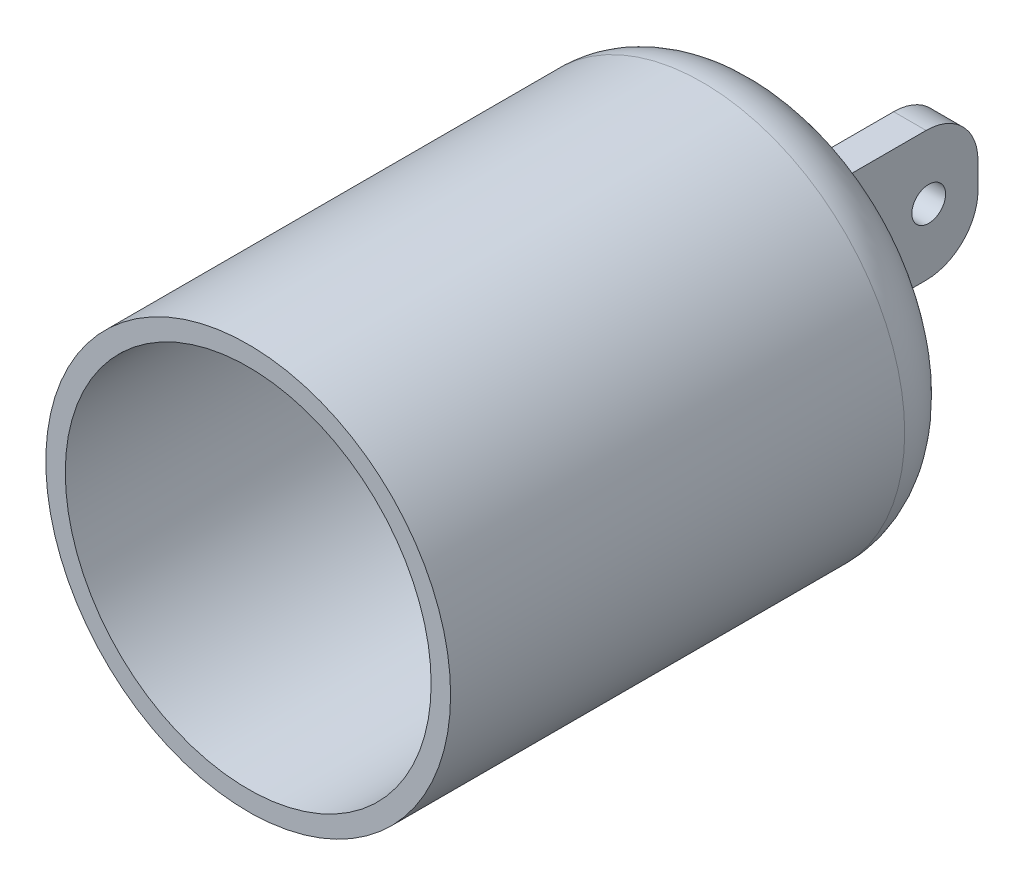
ISO-10303-21;
HEADER;
FILE_DESCRIPTION(('STEP AP214'),'2;1');
FILE_NAME('part.step','',(''),(''),'','','');
FILE_SCHEMA(('AUTOMOTIVE_DESIGN { 1 0 10303 214 1 1 1 1 }'));
ENDSEC;
DATA;
#1=APPLICATION_CONTEXT('core data for automotive mechanical design processes');
#2=APPLICATION_PROTOCOL_DEFINITION('international standard','automotive_design',2000,#1);
#3=PRODUCT_CONTEXT('',#1,'mechanical');
#4=PRODUCT('Part','Part','',(#3));
#5=PRODUCT_RELATED_PRODUCT_CATEGORY('part','',(#4));
#6=PRODUCT_DEFINITION_FORMATION('','',#4);
#7=PRODUCT_DEFINITION_CONTEXT('part definition',#1,'design');
#8=PRODUCT_DEFINITION('design','',#6,#7);
#9=PRODUCT_DEFINITION_SHAPE('','',#8);
#10=(LENGTH_UNIT() NAMED_UNIT(*) SI_UNIT(.MILLI.,.METRE.));
#11=(NAMED_UNIT(*) PLANE_ANGLE_UNIT() SI_UNIT($,.RADIAN.));
#12=(NAMED_UNIT(*) SI_UNIT($,.STERADIAN.) SOLID_ANGLE_UNIT());
#13=UNCERTAINTY_MEASURE_WITH_UNIT(LENGTH_MEASURE(1.E-05),#10,'distance_accuracy_value','');
#14=(GEOMETRIC_REPRESENTATION_CONTEXT(3) GLOBAL_UNCERTAINTY_ASSIGNED_CONTEXT((#13)) GLOBAL_UNIT_ASSIGNED_CONTEXT((#10,
#11,#12)) REPRESENTATION_CONTEXT('',''));
#15=CARTESIAN_POINT('',(0.,0.,0.));
#16=DIRECTION('',(0.,0.,1.));
#17=DIRECTION('',(1.,0.,0.));
#18=AXIS2_PLACEMENT_3D('',#15,#16,#17);
#19=CARTESIAN_POINT('',(0.,0.,0.));
#20=DIRECTION('',(0.,0.,1.));
#21=DIRECTION('',(1.,0.,0.));
#22=AXIS2_PLACEMENT_3D('',#19,#20,#21);
#23=PLANE('',#22);
#24=CARTESIAN_POINT('',(0.,0.,0.));
#25=DIRECTION('',(0.,0.,1.));
#26=DIRECTION('',(1.,0.,0.));
#27=AXIS2_PLACEMENT_3D('',#24,#25,#26);
#28=CIRCLE('',#27,106.);
#29=CARTESIAN_POINT('',(106.,0.,0.));
#30=VERTEX_POINT('',#29);
#31=EDGE_CURVE('E11',#30,#30,#28,.F.);
#32=ORIENTED_EDGE('',*,*,#31,.T.);
#33=EDGE_LOOP('',(#32));
#34=FACE_BOUND('',#33,.T.);
#35=DIRECTION('',(1.,0.,0.));
#36=VECTOR('',#35,1.);
#37=CARTESIAN_POINT('',(-12.5,70.,0.));
#38=LINE('',#37,#36);
#39=CARTESIAN_POINT('',(32.5,70.,0.));
#40=VERTEX_POINT('',#39);
#41=CARTESIAN_POINT('',(-32.5,70.,0.));
#42=VERTEX_POINT('',#41);
#43=EDGE_CURVE('E213',#40,#42,#38,.F.);
#44=ORIENTED_EDGE('',*,*,#43,.T.);
#45=DIRECTION('',(0.,1.,0.));
#46=VECTOR('',#45,1.);
#47=CARTESIAN_POINT('',(-32.5,-50.,0.));
#48=LINE('',#47,#46);
#49=CARTESIAN_POINT('',(-32.5,-70.,0.));
#50=VERTEX_POINT('',#49);
#51=EDGE_CURVE('E219',#42,#50,#48,.F.);
#52=ORIENTED_EDGE('',*,*,#51,.T.);
#53=DIRECTION('',(-1.,0.,0.));
#54=VECTOR('',#53,1.);
#55=CARTESIAN_POINT('',(12.5,-70.,0.));
#56=LINE('',#55,#54);
#57=CARTESIAN_POINT('',(32.5,-70.,0.));
#58=VERTEX_POINT('',#57);
#59=EDGE_CURVE('E217',#50,#58,#56,.F.);
#60=ORIENTED_EDGE('',*,*,#59,.T.);
#61=DIRECTION('',(0.,-1.,0.));
#62=VECTOR('',#61,1.);
#63=CARTESIAN_POINT('',(32.5,50.,0.));
#64=LINE('',#63,#62);
#65=EDGE_CURVE('E215',#58,#40,#64,.F.);
#66=ORIENTED_EDGE('',*,*,#65,.T.);
#67=EDGE_LOOP('',(#44,#52,#60,#66));
#68=FACE_BOUND('',#67,.T.);
#69=ADVANCED_FACE('F39',(#34,#68),#23,.F.);
#70=CARTESIAN_POINT('',(0.,0.,400.));
#71=DIRECTION('',(0.,0.,-1.));
#72=DIRECTION('',(-1.,0.,0.));
#73=AXIS2_PLACEMENT_3D('',#70,#71,#72);
#74=CYLINDRICAL_SURFACE('',#73,156.);
#75=CARTESIAN_POINT('',(0.,0.,50.));
#76=DIRECTION('',(0.,0.,1.));
#77=DIRECTION('',(1.,0.,0.));
#78=AXIS2_PLACEMENT_3D('',#75,#76,#77);
#79=CIRCLE('',#78,156.);
#80=CARTESIAN_POINT('',(156.,0.,50.));
#81=VERTEX_POINT('',#80);
#82=EDGE_CURVE('E47',#81,#81,#79,.T.);
#83=ORIENTED_EDGE('',*,*,#82,.T.);
#84=EDGE_LOOP('',(#83));
#85=FACE_BOUND('',#84,.T.);
#86=CARTESIAN_POINT('',(0.,0.,400.));
#87=DIRECTION('',(0.,0.,1.));
#88=DIRECTION('',(1.,0.,0.));
#89=AXIS2_PLACEMENT_3D('',#86,#87,#88);
#90=CIRCLE('',#89,156.);
#91=CARTESIAN_POINT('',(156.,0.,400.));
#92=VERTEX_POINT('',#91);
#93=EDGE_CURVE('E187',#92,#92,#90,.T.);
#94=ORIENTED_EDGE('',*,*,#93,.F.);
#95=EDGE_LOOP('',(#94));
#96=FACE_BOUND('',#95,.T.);
#97=ADVANCED_FACE('F236',(#85,#96),#74,.T.);
#98=CARTESIAN_POINT('',(0.,0.,400.));
#99=DIRECTION('',(0.,0.,1.));
#100=DIRECTION('',(1.,0.,0.));
#101=AXIS2_PLACEMENT_3D('',#98,#99,#100);
#102=PLANE('',#101);
#103=CARTESIAN_POINT('',(0.,0.,400.));
#104=DIRECTION('',(0.,0.,1.));
#105=DIRECTION('',(1.,0.,0.));
#106=AXIS2_PLACEMENT_3D('',#103,#104,#105);
#107=CIRCLE('',#106,141.);
#108=CARTESIAN_POINT('',(141.,0.,400.));
#109=VERTEX_POINT('',#108);
#110=EDGE_CURVE('E144',#109,#109,#107,.T.);
#111=ORIENTED_EDGE('',*,*,#110,.F.);
#112=EDGE_LOOP('',(#111));
#113=FACE_BOUND('',#112,.T.);
#114=ORIENTED_EDGE('',*,*,#93,.T.);
#115=EDGE_LOOP('',(#114));
#116=FACE_BOUND('',#115,.T.);
#117=ADVANCED_FACE('F259',(#113,#116),#102,.T.);
#118=CARTESIAN_POINT('',(12.5,-50.,-150.));
#119=DIRECTION('',(-1.,0.,0.));
#120=DIRECTION('',(0.,0.,1.));
#121=AXIS2_PLACEMENT_3D('',#118,#119,#120);
#122=PLANE('',#121);
#123=CARTESIAN_POINT('',(12.5,0.,-112.));
#124=DIRECTION('',(1.,0.,0.));
#125=DIRECTION('',(0.,0.,-1.));
#126=AXIS2_PLACEMENT_3D('',#123,#124,#125);
#127=CIRCLE('',#126,13.);
#128=CARTESIAN_POINT('',(12.5,0.,-125.));
#129=VERTEX_POINT('',#128);
#130=EDGE_CURVE('E167',#129,#129,#127,.T.);
#131=ORIENTED_EDGE('',*,*,#130,.F.);
#132=EDGE_LOOP('',(#131));
#133=FACE_BOUND('',#132,.T.);
#134=DIRECTION('',(0.,0.,1.));
#135=VECTOR('',#134,1.);
#136=CARTESIAN_POINT('',(12.5,50.,-150.));
#137=LINE('',#136,#135);
#138=CARTESIAN_POINT('',(12.5,50.,-110.));
#139=VERTEX_POINT('',#138);
#140=CARTESIAN_POINT('',(12.5,50.,-20.));
#141=VERTEX_POINT('',#140);
#142=EDGE_CURVE('E178',#139,#141,#137,.T.);
#143=ORIENTED_EDGE('',*,*,#142,.T.);
#144=DIRECTION('',(0.,-1.,0.));
#145=VECTOR('',#144,1.);
#146=CARTESIAN_POINT('',(12.5,-50.,-20.));
#147=LINE('',#146,#145);
#148=CARTESIAN_POINT('',(12.5,-50.,-20.));
#149=VERTEX_POINT('',#148);
#150=EDGE_CURVE('E61',#141,#149,#147,.T.);
#151=ORIENTED_EDGE('',*,*,#150,.T.);
#152=DIRECTION('',(0.,0.,1.));
#153=VECTOR('',#152,1.);
#154=CARTESIAN_POINT('',(12.5,-50.,-150.));
#155=LINE('',#154,#153);
#156=CARTESIAN_POINT('',(12.5,-50.,-110.));
#157=VERTEX_POINT('',#156);
#158=EDGE_CURVE('E185',#157,#149,#155,.T.);
#159=ORIENTED_EDGE('',*,*,#158,.F.);
#160=CARTESIAN_POINT('',(12.5,-10.,-110.));
#161=DIRECTION('',(-1.,0.,0.));
#162=DIRECTION('',(0.,0.,1.));
#163=AXIS2_PLACEMENT_3D('',#160,#161,#162);
#164=CIRCLE('',#163,40.);
#165=CARTESIAN_POINT('',(12.5,-10.,-150.));
#166=VERTEX_POINT('',#165);
#167=EDGE_CURVE('E198',#157,#166,#164,.F.);
#168=ORIENTED_EDGE('',*,*,#167,.T.);
#169=DIRECTION('',(0.,-1.,0.));
#170=VECTOR('',#169,1.);
#171=CARTESIAN_POINT('',(12.5,-50.,-150.));
#172=LINE('',#171,#170);
#173=CARTESIAN_POINT('',(12.5,10.,-150.));
#174=VERTEX_POINT('',#173);
#175=EDGE_CURVE('E172',#174,#166,#172,.T.);
#176=ORIENTED_EDGE('',*,*,#175,.F.);
#177=CARTESIAN_POINT('',(12.5,10.,-110.));
#178=DIRECTION('',(-1.,0.,0.));
#179=DIRECTION('',(0.,0.,1.));
#180=AXIS2_PLACEMENT_3D('',#177,#178,#179);
#181=CIRCLE('',#180,40.);
#182=EDGE_CURVE('E200',#174,#139,#181,.F.);
#183=ORIENTED_EDGE('',*,*,#182,.T.);
#184=EDGE_LOOP('',(#143,#151,#159,#168,#176,#183));
#185=FACE_BOUND('',#184,.T.);
#186=ADVANCED_FACE('F309',(#133,#185),#122,.F.);
#187=CARTESIAN_POINT('',(-12.5,-50.,-150.));
#188=DIRECTION('',(0.,1.,0.));
#189=DIRECTION('',(0.,0.,1.));
#190=AXIS2_PLACEMENT_3D('',#187,#188,#189);
#191=PLANE('',#190);
#192=ORIENTED_EDGE('',*,*,#158,.T.);
#193=DIRECTION('',(-1.,0.,0.));
#194=VECTOR('',#193,1.);
#195=CARTESIAN_POINT('',(-12.5,-50.,-20.));
#196=LINE('',#195,#194);
#197=CARTESIAN_POINT('',(-12.5,-50.,-20.));
#198=VERTEX_POINT('',#197);
#199=EDGE_CURVE('E222',#149,#198,#196,.T.);
#200=ORIENTED_EDGE('',*,*,#199,.T.);
#201=DIRECTION('',(0.,0.,1.));
#202=VECTOR('',#201,1.);
#203=CARTESIAN_POINT('',(-12.5,-50.,-150.));
#204=LINE('',#203,#202);
#205=CARTESIAN_POINT('',(-12.5,-50.,-110.));
#206=VERTEX_POINT('',#205);
#207=EDGE_CURVE('E182',#206,#198,#204,.T.);
#208=ORIENTED_EDGE('',*,*,#207,.F.);
#209=DIRECTION('',(-1.,0.,0.));
#210=VECTOR('',#209,1.);
#211=CARTESIAN_POINT('',(12.5,-50.,-110.));
#212=LINE('',#211,#210);
#213=EDGE_CURVE('E208',#206,#157,#212,.F.);
#214=ORIENTED_EDGE('',*,*,#213,.T.);
#215=EDGE_LOOP('',(#192,#200,#208,#214));
#216=FACE_BOUND('',#215,.T.);
#217=ADVANCED_FACE('F297',(#216),#191,.F.);
#218=CARTESIAN_POINT('',(-12.5,-50.,-150.));
#219=DIRECTION('',(1.,0.,0.));
#220=DIRECTION('',(0.,0.,-1.));
#221=AXIS2_PLACEMENT_3D('',#218,#219,#220);
#222=PLANE('',#221);
#223=CARTESIAN_POINT('',(-12.5,0.,-112.));
#224=DIRECTION('',(1.,0.,0.));
#225=DIRECTION('',(0.,0.,-1.));
#226=AXIS2_PLACEMENT_3D('',#223,#224,#225);
#227=CIRCLE('',#226,13.);
#228=CARTESIAN_POINT('',(-12.5,0.,-125.));
#229=VERTEX_POINT('',#228);
#230=EDGE_CURVE('E170',#229,#229,#227,.T.);
#231=ORIENTED_EDGE('',*,*,#230,.T.);
#232=EDGE_LOOP('',(#231));
#233=FACE_BOUND('',#232,.T.);
#234=ORIENTED_EDGE('',*,*,#207,.T.);
#235=DIRECTION('',(0.,1.,0.));
#236=VECTOR('',#235,1.);
#237=CARTESIAN_POINT('',(-12.5,50.,-20.));
#238=LINE('',#237,#236);
#239=CARTESIAN_POINT('',(-12.5,50.,-20.));
#240=VERTEX_POINT('',#239);
#241=EDGE_CURVE('E210',#198,#240,#238,.T.);
#242=ORIENTED_EDGE('',*,*,#241,.T.);
#243=DIRECTION('',(0.,0.,1.));
#244=VECTOR('',#243,1.);
#245=CARTESIAN_POINT('',(-12.5,50.,-150.));
#246=LINE('',#245,#244);
#247=CARTESIAN_POINT('',(-12.5,50.,-110.));
#248=VERTEX_POINT('',#247);
#249=EDGE_CURVE('E180',#248,#240,#246,.T.);
#250=ORIENTED_EDGE('',*,*,#249,.F.);
#251=CARTESIAN_POINT('',(-12.5,10.,-110.));
#252=DIRECTION('',(1.,0.,0.));
#253=DIRECTION('',(0.,0.,-1.));
#254=AXIS2_PLACEMENT_3D('',#251,#252,#253);
#255=CIRCLE('',#254,40.);
#256=CARTESIAN_POINT('',(-12.5,10.,-150.));
#257=VERTEX_POINT('',#256);
#258=EDGE_CURVE('E206',#248,#257,#255,.F.);
#259=ORIENTED_EDGE('',*,*,#258,.T.);
#260=DIRECTION('',(0.,1.,0.));
#261=VECTOR('',#260,1.);
#262=CARTESIAN_POINT('',(-12.5,-50.,-150.));
#263=LINE('',#262,#261);
#264=CARTESIAN_POINT('',(-12.5,-10.,-150.));
#265=VERTEX_POINT('',#264);
#266=EDGE_CURVE('E175',#265,#257,#263,.T.);
#267=ORIENTED_EDGE('',*,*,#266,.F.);
#268=CARTESIAN_POINT('',(-12.5,-10.,-110.));
#269=DIRECTION('',(1.,0.,0.));
#270=DIRECTION('',(0.,0.,-1.));
#271=AXIS2_PLACEMENT_3D('',#268,#269,#270);
#272=CIRCLE('',#271,40.);
#273=EDGE_CURVE('E204',#265,#206,#272,.F.);
#274=ORIENTED_EDGE('',*,*,#273,.T.);
#275=EDGE_LOOP('',(#234,#242,#250,#259,#267,#274));
#276=FACE_BOUND('',#275,.T.);
#277=ADVANCED_FACE('F300',(#233,#276),#222,.F.);
#278=CARTESIAN_POINT('',(-12.5,50.,-150.));
#279=DIRECTION('',(0.,-1.,0.));
#280=DIRECTION('',(0.,0.,-1.));
#281=AXIS2_PLACEMENT_3D('',#278,#279,#280);
#282=PLANE('',#281);
#283=ORIENTED_EDGE('',*,*,#249,.T.);
#284=DIRECTION('',(1.,0.,0.));
#285=VECTOR('',#284,1.);
#286=CARTESIAN_POINT('',(12.5,50.,-20.));
#287=LINE('',#286,#285);
#288=EDGE_CURVE('E54',#240,#141,#287,.T.);
#289=ORIENTED_EDGE('',*,*,#288,.T.);
#290=ORIENTED_EDGE('',*,*,#142,.F.);
#291=DIRECTION('',(1.,0.,0.));
#292=VECTOR('',#291,1.);
#293=CARTESIAN_POINT('',(-12.5,50.,-110.));
#294=LINE('',#293,#292);
#295=EDGE_CURVE('E202',#139,#248,#294,.F.);
#296=ORIENTED_EDGE('',*,*,#295,.T.);
#297=EDGE_LOOP('',(#283,#289,#290,#296));
#298=FACE_BOUND('',#297,.T.);
#299=ADVANCED_FACE('F311',(#298),#282,.F.);
#300=CARTESIAN_POINT('',(0.,0.,-150.));
#301=DIRECTION('',(0.,0.,-1.));
#302=DIRECTION('',(-1.,0.,0.));
#303=AXIS2_PLACEMENT_3D('',#300,#301,#302);
#304=PLANE('',#303);
#305=ORIENTED_EDGE('',*,*,#266,.T.);
#306=DIRECTION('',(1.,0.,0.));
#307=VECTOR('',#306,1.);
#308=CARTESIAN_POINT('',(12.5,10.,-150.));
#309=LINE('',#308,#307);
#310=EDGE_CURVE('E195',#257,#174,#309,.T.);
#311=ORIENTED_EDGE('',*,*,#310,.T.);
#312=ORIENTED_EDGE('',*,*,#175,.T.);
#313=DIRECTION('',(-1.,0.,0.));
#314=VECTOR('',#313,1.);
#315=CARTESIAN_POINT('',(-12.5,-10.,-150.));
#316=LINE('',#315,#314);
#317=EDGE_CURVE('E190',#166,#265,#316,.T.);
#318=ORIENTED_EDGE('',*,*,#317,.T.);
#319=EDGE_LOOP('',(#305,#311,#312,#318));
#320=FACE_BOUND('',#319,.T.);
#321=ADVANCED_FACE('F306',(#320),#304,.T.);
#322=CARTESIAN_POINT('',(-156.,0.,-112.));
#323=DIRECTION('',(1.,0.,0.));
#324=DIRECTION('',(0.,0.,-1.));
#325=AXIS2_PLACEMENT_3D('',#322,#323,#324);
#326=CYLINDRICAL_SURFACE('',#325,13.);
#327=ORIENTED_EDGE('',*,*,#130,.T.);
#328=EDGE_LOOP('',(#327));
#329=FACE_BOUND('',#328,.T.);
#330=ORIENTED_EDGE('',*,*,#230,.F.);
#331=EDGE_LOOP('',(#330));
#332=FACE_BOUND('',#331,.T.);
#333=ADVANCED_FACE('F269',(#329,#332),#326,.F.);
#334=CARTESIAN_POINT('',(0.,10.,-110.));
#335=DIRECTION('',(-1.,0.,0.));
#336=DIRECTION('',(0.,0.,1.));
#337=AXIS2_PLACEMENT_3D('',#334,#335,#336);
#338=CYLINDRICAL_SURFACE('',#337,40.);
#339=ORIENTED_EDGE('',*,*,#258,.F.);
#340=ORIENTED_EDGE('',*,*,#295,.F.);
#341=ORIENTED_EDGE('',*,*,#182,.F.);
#342=ORIENTED_EDGE('',*,*,#310,.F.);
#343=EDGE_LOOP('',(#339,#340,#341,#342));
#344=FACE_BOUND('',#343,.T.);
#345=ADVANCED_FACE('F265',(#344),#338,.T.);
#346=CARTESIAN_POINT('',(0.,-10.,-110.));
#347=DIRECTION('',(1.,0.,0.));
#348=DIRECTION('',(0.,0.,-1.));
#349=AXIS2_PLACEMENT_3D('',#346,#347,#348);
#350=CYLINDRICAL_SURFACE('',#349,40.);
#351=ORIENTED_EDGE('',*,*,#167,.F.);
#352=ORIENTED_EDGE('',*,*,#213,.F.);
#353=ORIENTED_EDGE('',*,*,#273,.F.);
#354=ORIENTED_EDGE('',*,*,#317,.F.);
#355=EDGE_LOOP('',(#351,#352,#353,#354));
#356=FACE_BOUND('',#355,.T.);
#357=ADVANCED_FACE('F268',(#356),#350,.T.);
#358=CARTESIAN_POINT('',(32.5,-50.,-20.));
#359=DIRECTION('',(0.,1.,0.));
#360=DIRECTION('',(0.,0.,1.));
#361=AXIS2_PLACEMENT_3D('',#358,#359,#360);
#362=CYLINDRICAL_SURFACE('',#361,20.);
#363=CARTESIAN_POINT('',(32.5,70.,-20.));
#364=DIRECTION('',(-0.707106781186547,0.707106781186547,0.));
#365=DIRECTION('',(-0.707106781186547,-0.707106781186547,0.));
#366=AXIS2_PLACEMENT_3D('',#363,#364,#365);
#367=ELLIPSE('',#366,28.2842712474619,20.);
#368=EDGE_CURVE('E229',#40,#141,#367,.F.);
#369=ORIENTED_EDGE('',*,*,#368,.F.);
#370=ORIENTED_EDGE('',*,*,#65,.F.);
#371=CARTESIAN_POINT('',(32.5,-70.,-20.));
#372=DIRECTION('',(0.707106781186547,0.707106781186547,0.));
#373=DIRECTION('',(-0.707106781186547,0.707106781186547,0.));
#374=AXIS2_PLACEMENT_3D('',#371,#372,#373);
#375=ELLIPSE('',#374,28.2842712474619,20.);
#376=EDGE_CURVE('E171',#149,#58,#375,.T.);
#377=ORIENTED_EDGE('',*,*,#376,.F.);
#378=ORIENTED_EDGE('',*,*,#150,.F.);
#379=EDGE_LOOP('',(#369,#370,#377,#378));
#380=FACE_BOUND('',#379,.T.);
#381=ADVANCED_FACE('F272',(#380),#362,.F.);
#382=CARTESIAN_POINT('',(-12.5,-70.,-20.));
#383=DIRECTION('',(1.,0.,0.));
#384=DIRECTION('',(0.,0.,-1.));
#385=AXIS2_PLACEMENT_3D('',#382,#383,#384);
#386=CYLINDRICAL_SURFACE('',#385,20.);
#387=ORIENTED_EDGE('',*,*,#376,.T.);
#388=ORIENTED_EDGE('',*,*,#59,.F.);
#389=CARTESIAN_POINT('',(-32.5,-70.,-20.));
#390=DIRECTION('',(0.707106781186547,-0.707106781186547,0.));
#391=DIRECTION('',(0.707106781186547,0.707106781186547,0.));
#392=AXIS2_PLACEMENT_3D('',#389,#390,#391);
#393=ELLIPSE('',#392,28.2842712474619,20.);
#394=EDGE_CURVE('E227',#198,#50,#393,.T.);
#395=ORIENTED_EDGE('',*,*,#394,.F.);
#396=ORIENTED_EDGE('',*,*,#199,.F.);
#397=EDGE_LOOP('',(#387,#388,#395,#396));
#398=FACE_BOUND('',#397,.T.);
#399=ADVANCED_FACE('F277',(#398),#386,.F.);
#400=CARTESIAN_POINT('',(-12.5,70.,-20.));
#401=DIRECTION('',(-1.,0.,0.));
#402=DIRECTION('',(0.,0.,1.));
#403=AXIS2_PLACEMENT_3D('',#400,#401,#402);
#404=CYLINDRICAL_SURFACE('',#403,20.);
#405=ORIENTED_EDGE('',*,*,#368,.T.);
#406=ORIENTED_EDGE('',*,*,#288,.F.);
#407=CARTESIAN_POINT('',(-32.5,70.,-20.));
#408=DIRECTION('',(-0.707106781186547,-0.707106781186547,0.));
#409=DIRECTION('',(-0.707106781186547,0.707106781186547,0.));
#410=AXIS2_PLACEMENT_3D('',#407,#408,#409);
#411=ELLIPSE('',#410,28.2842712474619,20.);
#412=EDGE_CURVE('E166',#42,#240,#411,.F.);
#413=ORIENTED_EDGE('',*,*,#412,.F.);
#414=ORIENTED_EDGE('',*,*,#43,.F.);
#415=EDGE_LOOP('',(#405,#406,#413,#414));
#416=FACE_BOUND('',#415,.T.);
#417=ADVANCED_FACE('F249',(#416),#404,.F.);
#418=CARTESIAN_POINT('',(-32.5,-50.,-20.));
#419=DIRECTION('',(0.,-1.,0.));
#420=DIRECTION('',(0.,0.,-1.));
#421=AXIS2_PLACEMENT_3D('',#418,#419,#420);
#422=CYLINDRICAL_SURFACE('',#421,20.);
#423=ORIENTED_EDGE('',*,*,#394,.T.);
#424=ORIENTED_EDGE('',*,*,#51,.F.);
#425=ORIENTED_EDGE('',*,*,#412,.T.);
#426=ORIENTED_EDGE('',*,*,#241,.F.);
#427=EDGE_LOOP('',(#423,#424,#425,#426));
#428=FACE_BOUND('',#427,.T.);
#429=ADVANCED_FACE('F240',(#428),#422,.F.);
#430=CARTESIAN_POINT('',(0.,0.,50.));
#431=DIRECTION('',(0.,0.,1.));
#432=DIRECTION('',(1.,0.,0.));
#433=AXIS2_PLACEMENT_3D('',#430,#431,#432);
#434=TOROIDAL_SURFACE('',#433,106.,50.);
#435=ORIENTED_EDGE('',*,*,#31,.F.);
#436=EDGE_LOOP('',(#435));
#437=FACE_BOUND('',#436,.T.);
#438=ORIENTED_EDGE('',*,*,#82,.F.);
#439=EDGE_LOOP('',(#438));
#440=FACE_BOUND('',#439,.T.);
#441=ADVANCED_FACE('F41',(#437,#440),#434,.T.);
#442=CARTESIAN_POINT('',(0.,0.,15.));
#443=DIRECTION('',(0.,0.,1.));
#444=DIRECTION('',(1.,0.,0.));
#445=AXIS2_PLACEMENT_3D('',#442,#443,#444);
#446=PLANE('',#445);
#447=CARTESIAN_POINT('',(0.,0.,15.));
#448=DIRECTION('',(0.,0.,1.));
#449=DIRECTION('',(1.,0.,0.));
#450=AXIS2_PLACEMENT_3D('',#447,#448,#449);
#451=CIRCLE('',#450,106.);
#452=CARTESIAN_POINT('',(106.,0.,15.));
#453=VERTEX_POINT('',#452);
#454=EDGE_CURVE('E153',#453,#453,#451,.F.);
#455=ORIENTED_EDGE('',*,*,#454,.F.);
#456=EDGE_LOOP('',(#455));
#457=FACE_BOUND('',#456,.T.);
#458=DIRECTION('',(1.,0.,0.));
#459=VECTOR('',#458,1.);
#460=CARTESIAN_POINT('',(0.,70.,15.));
#461=LINE('',#460,#459);
#462=CARTESIAN_POINT('',(32.5,70.,15.));
#463=VERTEX_POINT('',#462);
#464=CARTESIAN_POINT('',(-32.5,70.,15.));
#465=VERTEX_POINT('',#464);
#466=EDGE_CURVE('E138',#463,#465,#461,.F.);
#467=ORIENTED_EDGE('',*,*,#466,.F.);
#468=DIRECTION('',(0.,1.,0.));
#469=VECTOR('',#468,1.);
#470=CARTESIAN_POINT('',(32.5,0.,15.));
#471=LINE('',#470,#469);
#472=CARTESIAN_POINT('',(32.5,-70.,15.));
#473=VERTEX_POINT('',#472);
#474=EDGE_CURVE('E143',#473,#463,#471,.T.);
#475=ORIENTED_EDGE('',*,*,#474,.F.);
#476=DIRECTION('',(1.,0.,0.));
#477=VECTOR('',#476,1.);
#478=CARTESIAN_POINT('',(0.,-70.,15.));
#479=LINE('',#478,#477);
#480=CARTESIAN_POINT('',(-32.5,-70.,15.));
#481=VERTEX_POINT('',#480);
#482=EDGE_CURVE('E149',#481,#473,#479,.T.);
#483=ORIENTED_EDGE('',*,*,#482,.F.);
#484=DIRECTION('',(0.,1.,0.));
#485=VECTOR('',#484,1.);
#486=CARTESIAN_POINT('',(-32.5,0.,15.));
#487=LINE('',#486,#485);
#488=EDGE_CURVE('E130',#465,#481,#487,.F.);
#489=ORIENTED_EDGE('',*,*,#488,.F.);
#490=EDGE_LOOP('',(#467,#475,#483,#489));
#491=FACE_BOUND('',#490,.T.);
#492=ADVANCED_FACE('F147',(#457,#491),#446,.T.);
#493=CARTESIAN_POINT('',(0.,0.,400.));
#494=DIRECTION('',(0.,0.,-1.));
#495=DIRECTION('',(-1.,0.,0.));
#496=AXIS2_PLACEMENT_3D('',#493,#494,#495);
#497=CYLINDRICAL_SURFACE('',#496,141.);
#498=CARTESIAN_POINT('',(0.,0.,50.));
#499=DIRECTION('',(0.,0.,-1.));
#500=DIRECTION('',(-1.,0.,0.));
#501=AXIS2_PLACEMENT_3D('',#498,#499,#500);
#502=CIRCLE('',#501,141.);
#503=CARTESIAN_POINT('',(-141.,0.,50.));
#504=VERTEX_POINT('',#503);
#505=EDGE_CURVE('E150',#504,#504,#502,.F.);
#506=ORIENTED_EDGE('',*,*,#505,.F.);
#507=EDGE_LOOP('',(#506));
#508=FACE_BOUND('',#507,.T.);
#509=ORIENTED_EDGE('',*,*,#110,.T.);
#510=EDGE_LOOP('',(#509));
#511=FACE_BOUND('',#510,.T.);
#512=ADVANCED_FACE('F246',(#508,#511),#497,.F.);
#513=CARTESIAN_POINT('',(32.5,-50.,-20.));
#514=DIRECTION('',(0.,1.,0.));
#515=DIRECTION('',(0.,0.,1.));
#516=AXIS2_PLACEMENT_3D('',#513,#514,#515);
#517=CYLINDRICAL_SURFACE('',#516,35.);
#518=CARTESIAN_POINT('',(32.5,-70.,-20.));
#519=DIRECTION('',(0.707106781186547,0.707106781186547,0.));
#520=DIRECTION('',(0.707106781186547,-0.707106781186547,0.));
#521=AXIS2_PLACEMENT_3D('',#518,#519,#520);
#522=ELLIPSE('',#521,49.4974746830583,35.);
#523=CARTESIAN_POINT('',(0.,-37.5,-7.00961894323341));
#524=VERTEX_POINT('',#523);
#525=EDGE_CURVE('E160',#524,#473,#522,.T.);
#526=ORIENTED_EDGE('',*,*,#525,.T.);
#527=ORIENTED_EDGE('',*,*,#474,.T.);
#528=CARTESIAN_POINT('',(32.5,70.,-20.));
#529=DIRECTION('',(-0.707106781186547,0.707106781186547,0.));
#530=DIRECTION('',(-0.707106781186547,-0.707106781186547,0.));
#531=AXIS2_PLACEMENT_3D('',#528,#529,#530);
#532=ELLIPSE('',#531,49.4974746830583,35.);
#533=CARTESIAN_POINT('',(0.,37.5,-7.00961894323341));
#534=VERTEX_POINT('',#533);
#535=EDGE_CURVE('E140',#463,#534,#532,.F.);
#536=ORIENTED_EDGE('',*,*,#535,.T.);
#537=DIRECTION('',(0.,1.,0.));
#538=VECTOR('',#537,1.);
#539=CARTESIAN_POINT('',(0.,-50.,-7.00961894323341));
#540=LINE('',#539,#538);
#541=EDGE_CURVE('E131',#524,#534,#540,.T.);
#542=ORIENTED_EDGE('',*,*,#541,.F.);
#543=EDGE_LOOP('',(#526,#527,#536,#542));
#544=FACE_BOUND('',#543,.T.);
#545=ADVANCED_FACE('F350',(#544),#517,.T.);
#546=CARTESIAN_POINT('',(-12.5,-70.,-20.));
#547=DIRECTION('',(1.,0.,0.));
#548=DIRECTION('',(0.,0.,-1.));
#549=AXIS2_PLACEMENT_3D('',#546,#547,#548);
#550=CYLINDRICAL_SURFACE('',#549,35.);
#551=CARTESIAN_POINT('',(-32.5,-70.,-20.));
#552=DIRECTION('',(0.707106781186547,-0.707106781186547,0.));
#553=DIRECTION('',(-0.707106781186547,-0.707106781186547,0.));
#554=AXIS2_PLACEMENT_3D('',#551,#552,#553);
#555=ELLIPSE('',#554,49.4974746830583,35.);
#556=EDGE_CURVE('E135',#524,#481,#555,.T.);
#557=ORIENTED_EDGE('',*,*,#556,.T.);
#558=ORIENTED_EDGE('',*,*,#482,.T.);
#559=ORIENTED_EDGE('',*,*,#525,.F.);
#560=EDGE_LOOP('',(#557,#558,#559));
#561=FACE_BOUND('',#560,.T.);
#562=ADVANCED_FACE('F347',(#561),#550,.T.);
#563=CARTESIAN_POINT('',(-12.5,70.,-20.));
#564=DIRECTION('',(-1.,0.,0.));
#565=DIRECTION('',(0.,0.,1.));
#566=AXIS2_PLACEMENT_3D('',#563,#564,#565);
#567=CYLINDRICAL_SURFACE('',#566,35.);
#568=ORIENTED_EDGE('',*,*,#535,.F.);
#569=ORIENTED_EDGE('',*,*,#466,.T.);
#570=CARTESIAN_POINT('',(-32.5,70.,-20.));
#571=DIRECTION('',(-0.707106781186547,-0.707106781186547,0.));
#572=DIRECTION('',(0.707106781186547,-0.707106781186547,0.));
#573=AXIS2_PLACEMENT_3D('',#570,#571,#572);
#574=ELLIPSE('',#573,49.4974746830583,35.);
#575=EDGE_CURVE('E125',#465,#534,#574,.F.);
#576=ORIENTED_EDGE('',*,*,#575,.T.);
#577=EDGE_LOOP('',(#568,#569,#576));
#578=FACE_BOUND('',#577,.T.);
#579=ADVANCED_FACE('F139',(#578),#567,.T.);
#580=CARTESIAN_POINT('',(-32.5,-50.,-20.));
#581=DIRECTION('',(0.,-1.,0.));
#582=DIRECTION('',(0.,0.,-1.));
#583=AXIS2_PLACEMENT_3D('',#580,#581,#582);
#584=CYLINDRICAL_SURFACE('',#583,35.);
#585=ORIENTED_EDGE('',*,*,#541,.T.);
#586=ORIENTED_EDGE('',*,*,#575,.F.);
#587=ORIENTED_EDGE('',*,*,#488,.T.);
#588=ORIENTED_EDGE('',*,*,#556,.F.);
#589=EDGE_LOOP('',(#585,#586,#587,#588));
#590=FACE_BOUND('',#589,.T.);
#591=ADVANCED_FACE('F127',(#590),#584,.T.);
#592=CARTESIAN_POINT('',(0.,0.,50.));
#593=DIRECTION('',(0.,0.,1.));
#594=DIRECTION('',(1.,0.,0.));
#595=AXIS2_PLACEMENT_3D('',#592,#593,#594);
#596=TOROIDAL_SURFACE('',#595,106.,35.);
#597=ORIENTED_EDGE('',*,*,#454,.T.);
#598=EDGE_LOOP('',(#597));
#599=FACE_BOUND('',#598,.T.);
#600=ORIENTED_EDGE('',*,*,#505,.T.);
#601=EDGE_LOOP('',(#600));
#602=FACE_BOUND('',#601,.T.);
#603=ADVANCED_FACE('F339',(#599,#602),#596,.F.);
#604=CLOSED_SHELL('',(#69,#97,#117,#186,#217,#277,#299,#321,#333,#345,#357,#381,#399,#417,#429,
#441,#492,#512,#545,#562,#579,#591,#603));
#605=MANIFOLD_SOLID_BREP('B2',#604);
#606=ADVANCED_BREP_SHAPE_REPRESENTATION('',(#18,#605),#14);
#607=SHAPE_DEFINITION_REPRESENTATION(#9,#606);
ENDSEC;
END-ISO-10303-21;
